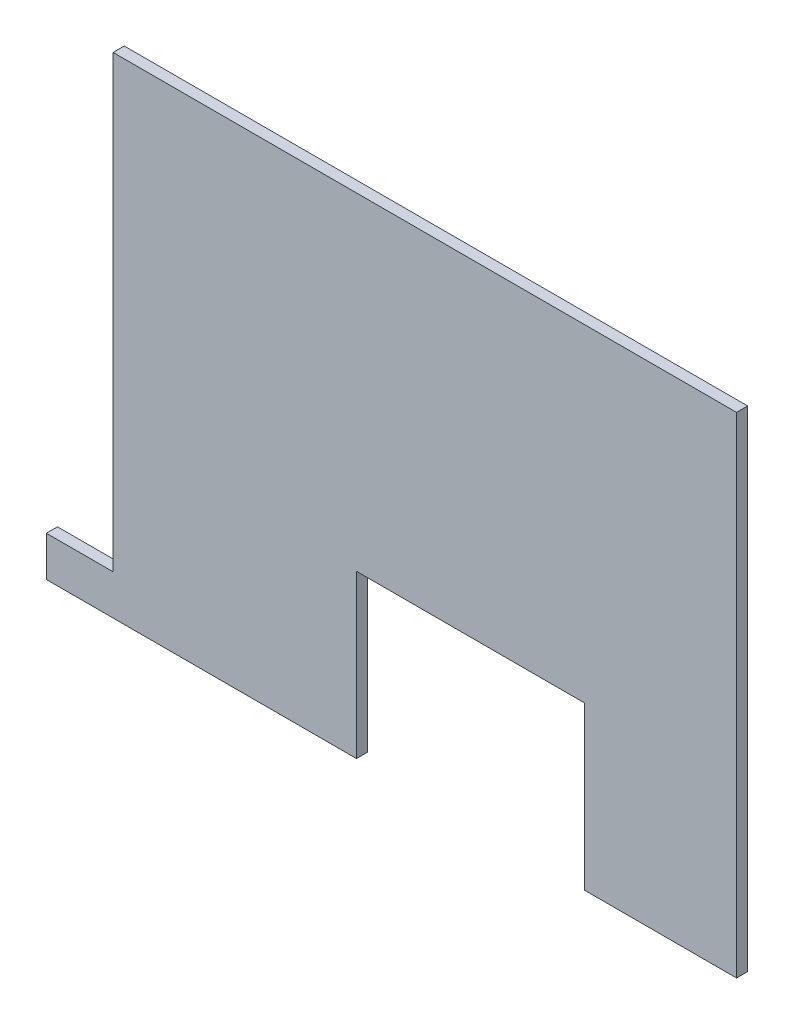
ISO-10303-21;
HEADER;
FILE_DESCRIPTION(('STEP AP214'),'2;1');
FILE_NAME('part.step','',(''),(''),'','','');
FILE_SCHEMA(('AUTOMOTIVE_DESIGN { 1 0 10303 214 1 1 1 1 }'));
ENDSEC;
DATA;
#1=APPLICATION_CONTEXT('core data for automotive mechanical design processes');
#2=APPLICATION_PROTOCOL_DEFINITION('international standard','automotive_design',2000,#1);
#3=PRODUCT_CONTEXT('',#1,'mechanical');
#4=PRODUCT('Part','Part','',(#3));
#5=PRODUCT_RELATED_PRODUCT_CATEGORY('part','',(#4));
#6=PRODUCT_DEFINITION_FORMATION('','',#4);
#7=PRODUCT_DEFINITION_CONTEXT('part definition',#1,'design');
#8=PRODUCT_DEFINITION('design','',#6,#7);
#9=PRODUCT_DEFINITION_SHAPE('','',#8);
#10=(LENGTH_UNIT() NAMED_UNIT(*) SI_UNIT(.MILLI.,.METRE.));
#11=(NAMED_UNIT(*) PLANE_ANGLE_UNIT() SI_UNIT($,.RADIAN.));
#12=(NAMED_UNIT(*) SI_UNIT($,.STERADIAN.) SOLID_ANGLE_UNIT());
#13=UNCERTAINTY_MEASURE_WITH_UNIT(LENGTH_MEASURE(1.E-05),#10,'distance_accuracy_value','');
#14=(GEOMETRIC_REPRESENTATION_CONTEXT(3) GLOBAL_UNCERTAINTY_ASSIGNED_CONTEXT((#13)) GLOBAL_UNIT_ASSIGNED_CONTEXT((#10,
#11,#12)) REPRESENTATION_CONTEXT('',''));
#15=CARTESIAN_POINT('',(0.,0.,0.));
#16=DIRECTION('',(0.,0.,1.));
#17=DIRECTION('',(1.,0.,0.));
#18=AXIS2_PLACEMENT_3D('',#15,#16,#17);
#19=CARTESIAN_POINT('',(71.6105148590981,0.,5.));
#20=DIRECTION('',(-1.,0.,0.));
#21=DIRECTION('',(0.,0.,1.));
#22=AXIS2_PLACEMENT_3D('',#19,#20,#21);
#23=PLANE('',#22);
#24=DIRECTION('',(0.,1.,0.));
#25=VECTOR('',#24,1.);
#26=CARTESIAN_POINT('',(71.6105148590981,0.,0.));
#27=LINE('',#26,#25);
#28=CARTESIAN_POINT('',(71.6105148590981,-110.,0.));
#29=VERTEX_POINT('',#28);
#30=CARTESIAN_POINT('',(71.6105148590981,-37.1652782393002,0.));
#31=VERTEX_POINT('',#30);
#32=EDGE_CURVE('E140',#29,#31,#27,.T.);
#33=ORIENTED_EDGE('',*,*,#32,.F.);
#34=DIRECTION('',(0.,0.,-1.));
#35=VECTOR('',#34,1.);
#36=CARTESIAN_POINT('',(71.6105148590981,-110.,5.));
#37=LINE('',#36,#35);
#38=CARTESIAN_POINT('',(71.6105148590981,-110.,5.));
#39=VERTEX_POINT('',#38);
#40=EDGE_CURVE('E11',#39,#29,#37,.T.);
#41=ORIENTED_EDGE('',*,*,#40,.F.);
#42=DIRECTION('',(0.,1.,0.));
#43=VECTOR('',#42,1.);
#44=CARTESIAN_POINT('',(71.6105148590981,0.,5.));
#45=LINE('',#44,#43);
#46=CARTESIAN_POINT('',(71.6105148590981,-37.1652782393002,5.));
#47=VERTEX_POINT('',#46);
#48=EDGE_CURVE('E163',#39,#47,#45,.T.);
#49=ORIENTED_EDGE('',*,*,#48,.T.);
#50=DIRECTION('',(0.,0.,-1.));
#51=VECTOR('',#50,1.);
#52=CARTESIAN_POINT('',(71.6105148590981,-37.1652782393002,5.));
#53=LINE('',#52,#51);
#54=EDGE_CURVE('E91',#47,#31,#53,.T.);
#55=ORIENTED_EDGE('',*,*,#54,.T.);
#56=EDGE_LOOP('',(#33,#41,#49,#55));
#57=FACE_BOUND('',#56,.T.);
#58=ADVANCED_FACE('F34',(#57),#23,.T.);
#59=CARTESIAN_POINT('',(0.,-110.,5.));
#60=DIRECTION('',(0.,1.,0.));
#61=DIRECTION('',(-1.,0.,0.));
#62=AXIS2_PLACEMENT_3D('',#59,#60,#61);
#63=PLANE('',#62);
#64=DIRECTION('',(1.,0.,0.));
#65=VECTOR('',#64,1.);
#66=CARTESIAN_POINT('',(0.,-110.,0.));
#67=LINE('',#66,#65);
#68=CARTESIAN_POINT('',(140.,-110.,0.));
#69=VERTEX_POINT('',#68);
#70=EDGE_CURVE('E143',#29,#69,#67,.T.);
#71=ORIENTED_EDGE('',*,*,#70,.T.);
#72=DIRECTION('',(0.,0.,-1.));
#73=VECTOR('',#72,1.);
#74=CARTESIAN_POINT('',(140.,-110.,5.));
#75=LINE('',#74,#73);
#76=CARTESIAN_POINT('',(140.,-110.,5.));
#77=VERTEX_POINT('',#76);
#78=EDGE_CURVE('E42',#77,#69,#75,.T.);
#79=ORIENTED_EDGE('',*,*,#78,.F.);
#80=DIRECTION('',(1.,0.,0.));
#81=VECTOR('',#80,1.);
#82=CARTESIAN_POINT('',(0.,-110.,5.));
#83=LINE('',#82,#81);
#84=EDGE_CURVE('E126',#39,#77,#83,.T.);
#85=ORIENTED_EDGE('',*,*,#84,.F.);
#86=ORIENTED_EDGE('',*,*,#40,.T.);
#87=EDGE_LOOP('',(#71,#79,#85,#86));
#88=FACE_BOUND('',#87,.T.);
#89=ADVANCED_FACE('F210',(#88),#63,.F.);
#90=CARTESIAN_POINT('',(140.,0.,5.));
#91=DIRECTION('',(-1.,0.,0.));
#92=DIRECTION('',(0.,-1.,0.));
#93=AXIS2_PLACEMENT_3D('',#90,#91,#92);
#94=PLANE('',#93);
#95=DIRECTION('',(0.,1.,0.));
#96=VECTOR('',#95,1.);
#97=CARTESIAN_POINT('',(140.,0.,0.));
#98=LINE('',#97,#96);
#99=CARTESIAN_POINT('',(140.,110.,0.));
#100=VERTEX_POINT('',#99);
#101=EDGE_CURVE('E145',#69,#100,#98,.T.);
#102=ORIENTED_EDGE('',*,*,#101,.T.);
#103=DIRECTION('',(0.,0.,-1.));
#104=VECTOR('',#103,1.);
#105=CARTESIAN_POINT('',(140.,110.,5.));
#106=LINE('',#105,#104);
#107=CARTESIAN_POINT('',(140.,110.,5.));
#108=VERTEX_POINT('',#107);
#109=EDGE_CURVE('E173',#108,#100,#106,.T.);
#110=ORIENTED_EDGE('',*,*,#109,.F.);
#111=DIRECTION('',(0.,1.,0.));
#112=VECTOR('',#111,1.);
#113=CARTESIAN_POINT('',(140.,0.,5.));
#114=LINE('',#113,#112);
#115=EDGE_CURVE('E181',#77,#108,#114,.T.);
#116=ORIENTED_EDGE('',*,*,#115,.F.);
#117=ORIENTED_EDGE('',*,*,#78,.T.);
#118=EDGE_LOOP('',(#102,#110,#116,#117));
#119=FACE_BOUND('',#118,.T.);
#120=ADVANCED_FACE('F179',(#119),#94,.F.);
#121=CARTESIAN_POINT('',(0.,110.,5.));
#122=DIRECTION('',(0.,1.,0.));
#123=DIRECTION('',(-1.,0.,0.));
#124=AXIS2_PLACEMENT_3D('',#121,#122,#123);
#125=PLANE('',#124);
#126=DIRECTION('',(1.,0.,0.));
#127=VECTOR('',#126,1.);
#128=CARTESIAN_POINT('',(0.,110.,0.));
#129=LINE('',#128,#127);
#130=CARTESIAN_POINT('',(-140.,110.,0.));
#131=VERTEX_POINT('',#130);
#132=EDGE_CURVE('E148',#131,#100,#129,.T.);
#133=ORIENTED_EDGE('',*,*,#132,.F.);
#134=DIRECTION('',(0.,0.,-1.));
#135=VECTOR('',#134,1.);
#136=CARTESIAN_POINT('',(-140.,110.,5.));
#137=LINE('',#136,#135);
#138=CARTESIAN_POINT('',(-140.,110.,5.));
#139=VERTEX_POINT('',#138);
#140=EDGE_CURVE('E171',#139,#131,#137,.T.);
#141=ORIENTED_EDGE('',*,*,#140,.F.);
#142=DIRECTION('',(1.,0.,0.));
#143=VECTOR('',#142,1.);
#144=CARTESIAN_POINT('',(0.,110.,5.));
#145=LINE('',#144,#143);
#146=EDGE_CURVE('E193',#139,#108,#145,.T.);
#147=ORIENTED_EDGE('',*,*,#146,.T.);
#148=ORIENTED_EDGE('',*,*,#109,.T.);
#149=EDGE_LOOP('',(#133,#141,#147,#148));
#150=FACE_BOUND('',#149,.T.);
#151=ADVANCED_FACE('F190',(#150),#125,.T.);
#152=CARTESIAN_POINT('',(-140.,0.,5.));
#153=DIRECTION('',(-1.,0.,0.));
#154=DIRECTION('',(0.,-1.,0.));
#155=AXIS2_PLACEMENT_3D('',#152,#153,#154);
#156=PLANE('',#155);
#157=DIRECTION('',(0.,1.,0.));
#158=VECTOR('',#157,1.);
#159=CARTESIAN_POINT('',(-140.,0.,0.));
#160=LINE('',#159,#158);
#161=CARTESIAN_POINT('',(-140.,-92.0000000000001,0.));
#162=VERTEX_POINT('',#161);
#163=EDGE_CURVE('E151',#162,#131,#160,.T.);
#164=ORIENTED_EDGE('',*,*,#163,.F.);
#165=DIRECTION('',(0.,0.,-1.));
#166=VECTOR('',#165,1.);
#167=CARTESIAN_POINT('',(-140.,-92.0000000000001,5.));
#168=LINE('',#167,#166);
#169=CARTESIAN_POINT('',(-140.,-92.0000000000001,5.));
#170=VERTEX_POINT('',#169);
#171=EDGE_CURVE('E169',#170,#162,#168,.T.);
#172=ORIENTED_EDGE('',*,*,#171,.F.);
#173=DIRECTION('',(0.,1.,0.));
#174=VECTOR('',#173,1.);
#175=CARTESIAN_POINT('',(-140.,0.,5.));
#176=LINE('',#175,#174);
#177=EDGE_CURVE('E196',#170,#139,#176,.T.);
#178=ORIENTED_EDGE('',*,*,#177,.T.);
#179=ORIENTED_EDGE('',*,*,#140,.T.);
#180=EDGE_LOOP('',(#164,#172,#178,#179));
#181=FACE_BOUND('',#180,.T.);
#182=ADVANCED_FACE('F228',(#181),#156,.T.);
#183=CARTESIAN_POINT('',(0.,-92.0000000000001,5.));
#184=DIRECTION('',(0.,-1.,0.));
#185=DIRECTION('',(0.,0.,-1.));
#186=AXIS2_PLACEMENT_3D('',#183,#184,#185);
#187=PLANE('',#186);
#188=DIRECTION('',(-1.,0.,0.));
#189=VECTOR('',#188,1.);
#190=CARTESIAN_POINT('',(0.,-92.0000000000001,0.));
#191=LINE('',#190,#189);
#192=CARTESIAN_POINT('',(-170.,-92.0000000000001,0.));
#193=VERTEX_POINT('',#192);
#194=EDGE_CURVE('E154',#162,#193,#191,.T.);
#195=ORIENTED_EDGE('',*,*,#194,.T.);
#196=DIRECTION('',(0.,0.,-1.));
#197=VECTOR('',#196,1.);
#198=CARTESIAN_POINT('',(-170.,-92.0000000000001,5.));
#199=LINE('',#198,#197);
#200=CARTESIAN_POINT('',(-170.,-92.0000000000001,5.));
#201=VERTEX_POINT('',#200);
#202=EDGE_CURVE('E167',#201,#193,#199,.T.);
#203=ORIENTED_EDGE('',*,*,#202,.F.);
#204=DIRECTION('',(-1.,0.,0.));
#205=VECTOR('',#204,1.);
#206=CARTESIAN_POINT('',(0.,-92.0000000000001,5.));
#207=LINE('',#206,#205);
#208=EDGE_CURVE('E198',#170,#201,#207,.T.);
#209=ORIENTED_EDGE('',*,*,#208,.F.);
#210=ORIENTED_EDGE('',*,*,#171,.T.);
#211=EDGE_LOOP('',(#195,#203,#209,#210));
#212=FACE_BOUND('',#211,.T.);
#213=ADVANCED_FACE('F224',(#212),#187,.F.);
#214=CARTESIAN_POINT('',(-170.,0.,5.));
#215=DIRECTION('',(-1.,0.,0.));
#216=DIRECTION('',(0.,0.,1.));
#217=AXIS2_PLACEMENT_3D('',#214,#215,#216);
#218=PLANE('',#217);
#219=DIRECTION('',(0.,1.,0.));
#220=VECTOR('',#219,1.);
#221=CARTESIAN_POINT('',(-170.,0.,0.));
#222=LINE('',#221,#220);
#223=CARTESIAN_POINT('',(-170.,-110.,0.));
#224=VERTEX_POINT('',#223);
#225=EDGE_CURVE('E157',#224,#193,#222,.T.);
#226=ORIENTED_EDGE('',*,*,#225,.F.);
#227=DIRECTION('',(0.,0.,-1.));
#228=VECTOR('',#227,1.);
#229=CARTESIAN_POINT('',(-170.,-110.,5.));
#230=LINE('',#229,#228);
#231=CARTESIAN_POINT('',(-170.,-110.,5.));
#232=VERTEX_POINT('',#231);
#233=EDGE_CURVE('E131',#232,#224,#230,.T.);
#234=ORIENTED_EDGE('',*,*,#233,.F.);
#235=DIRECTION('',(0.,1.,0.));
#236=VECTOR('',#235,1.);
#237=CARTESIAN_POINT('',(-170.,0.,5.));
#238=LINE('',#237,#236);
#239=EDGE_CURVE('E123',#232,#201,#238,.T.);
#240=ORIENTED_EDGE('',*,*,#239,.T.);
#241=ORIENTED_EDGE('',*,*,#202,.T.);
#242=EDGE_LOOP('',(#226,#234,#240,#241));
#243=FACE_BOUND('',#242,.T.);
#244=ADVANCED_FACE('F205',(#243),#218,.T.);
#245=CARTESIAN_POINT('',(-30.6981600577575,-110.,0.));
#246=VERTEX_POINT('',#245);
#247=EDGE_CURVE('E130',#224,#246,#67,.T.);
#248=ORIENTED_EDGE('',*,*,#247,.T.);
#249=DIRECTION('',(0.,0.,-1.));
#250=VECTOR('',#249,1.);
#251=CARTESIAN_POINT('',(-30.6981600577575,-110.,5.));
#252=LINE('',#251,#250);
#253=CARTESIAN_POINT('',(-30.6981600577575,-110.,5.));
#254=VERTEX_POINT('',#253);
#255=EDGE_CURVE('E127',#254,#246,#252,.T.);
#256=ORIENTED_EDGE('',*,*,#255,.F.);
#257=EDGE_CURVE('E117',#232,#254,#83,.T.);
#258=ORIENTED_EDGE('',*,*,#257,.F.);
#259=ORIENTED_EDGE('',*,*,#233,.T.);
#260=EDGE_LOOP('',(#248,#256,#258,#259));
#261=FACE_BOUND('',#260,.T.);
#262=ADVANCED_FACE('F128',(#261),#63,.F.);
#263=CARTESIAN_POINT('',(-30.6981600577575,0.,5.));
#264=DIRECTION('',(-1.,0.,0.));
#265=DIRECTION('',(0.,0.,1.));
#266=AXIS2_PLACEMENT_3D('',#263,#264,#265);
#267=PLANE('',#266);
#268=DIRECTION('',(0.,1.,0.));
#269=VECTOR('',#268,1.);
#270=CARTESIAN_POINT('',(-30.6981600577575,0.,0.));
#271=LINE('',#270,#269);
#272=CARTESIAN_POINT('',(-30.6981600577575,-37.1652782393002,0.));
#273=VERTEX_POINT('',#272);
#274=EDGE_CURVE('E84',#246,#273,#271,.T.);
#275=ORIENTED_EDGE('',*,*,#274,.T.);
#276=DIRECTION('',(0.,0.,-1.));
#277=VECTOR('',#276,1.);
#278=CARTESIAN_POINT('',(-30.6981600577575,-37.1652782393002,5.));
#279=LINE('',#278,#277);
#280=CARTESIAN_POINT('',(-30.6981600577575,-37.1652782393002,5.));
#281=VERTEX_POINT('',#280);
#282=EDGE_CURVE('E132',#281,#273,#279,.T.);
#283=ORIENTED_EDGE('',*,*,#282,.F.);
#284=DIRECTION('',(0.,1.,0.));
#285=VECTOR('',#284,1.);
#286=CARTESIAN_POINT('',(-30.6981600577575,0.,5.));
#287=LINE('',#286,#285);
#288=EDGE_CURVE('E121',#254,#281,#287,.T.);
#289=ORIENTED_EDGE('',*,*,#288,.F.);
#290=ORIENTED_EDGE('',*,*,#255,.T.);
#291=EDGE_LOOP('',(#275,#283,#289,#290));
#292=FACE_BOUND('',#291,.T.);
#293=ADVANCED_FACE('F134',(#292),#267,.F.);
#294=CARTESIAN_POINT('',(0.,-37.1652782393002,5.));
#295=DIRECTION('',(0.,1.,0.));
#296=DIRECTION('',(0.,0.,1.));
#297=AXIS2_PLACEMENT_3D('',#294,#295,#296);
#298=PLANE('',#297);
#299=DIRECTION('',(1.,0.,0.));
#300=VECTOR('',#299,1.);
#301=CARTESIAN_POINT('',(0.,-37.1652782393002,0.));
#302=LINE('',#301,#300);
#303=EDGE_CURVE('E161',#273,#31,#302,.T.);
#304=ORIENTED_EDGE('',*,*,#303,.T.);
#305=ORIENTED_EDGE('',*,*,#54,.F.);
#306=DIRECTION('',(1.,0.,0.));
#307=VECTOR('',#306,1.);
#308=CARTESIAN_POINT('',(0.,-37.1652782393002,5.));
#309=LINE('',#308,#307);
#310=EDGE_CURVE('E50',#281,#47,#309,.T.);
#311=ORIENTED_EDGE('',*,*,#310,.F.);
#312=ORIENTED_EDGE('',*,*,#282,.T.);
#313=EDGE_LOOP('',(#304,#305,#311,#312));
#314=FACE_BOUND('',#313,.T.);
#315=ADVANCED_FACE('F208',(#314),#298,.F.);
#316=CARTESIAN_POINT('',(0.,0.,5.));
#317=DIRECTION('',(0.,0.,1.));
#318=DIRECTION('',(1.,0.,0.));
#319=AXIS2_PLACEMENT_3D('',#316,#317,#318);
#320=PLANE('',#319);
#321=ORIENTED_EDGE('',*,*,#48,.F.);
#322=ORIENTED_EDGE('',*,*,#84,.T.);
#323=ORIENTED_EDGE('',*,*,#115,.T.);
#324=ORIENTED_EDGE('',*,*,#146,.F.);
#325=ORIENTED_EDGE('',*,*,#177,.F.);
#326=ORIENTED_EDGE('',*,*,#208,.T.);
#327=ORIENTED_EDGE('',*,*,#239,.F.);
#328=ORIENTED_EDGE('',*,*,#257,.T.);
#329=ORIENTED_EDGE('',*,*,#288,.T.);
#330=ORIENTED_EDGE('',*,*,#310,.T.);
#331=EDGE_LOOP('',(#321,#322,#323,#324,#325,#326,#327,#328,#329,#330));
#332=FACE_BOUND('',#331,.T.);
#333=ADVANCED_FACE('F119',(#332),#320,.T.);
#334=CARTESIAN_POINT('',(0.,0.,0.));
#335=DIRECTION('',(0.,0.,1.));
#336=DIRECTION('',(1.,0.,0.));
#337=AXIS2_PLACEMENT_3D('',#334,#335,#336);
#338=PLANE('',#337);
#339=ORIENTED_EDGE('',*,*,#32,.T.);
#340=ORIENTED_EDGE('',*,*,#303,.F.);
#341=ORIENTED_EDGE('',*,*,#274,.F.);
#342=ORIENTED_EDGE('',*,*,#247,.F.);
#343=ORIENTED_EDGE('',*,*,#225,.T.);
#344=ORIENTED_EDGE('',*,*,#194,.F.);
#345=ORIENTED_EDGE('',*,*,#163,.T.);
#346=ORIENTED_EDGE('',*,*,#132,.T.);
#347=ORIENTED_EDGE('',*,*,#101,.F.);
#348=ORIENTED_EDGE('',*,*,#70,.F.);
#349=EDGE_LOOP('',(#339,#340,#341,#342,#343,#344,#345,#346,#347,#348));
#350=FACE_BOUND('',#349,.T.);
#351=ADVANCED_FACE('F185',(#350),#338,.F.);
#352=CLOSED_SHELL('',(#58,#89,#120,#151,#182,#213,#244,#262,#293,#315,#333,#351));
#353=MANIFOLD_SOLID_BREP('B2',#352);
#354=ADVANCED_BREP_SHAPE_REPRESENTATION('',(#18,#353),#14);
#355=SHAPE_DEFINITION_REPRESENTATION(#9,#354);
ENDSEC;
END-ISO-10303-21;
